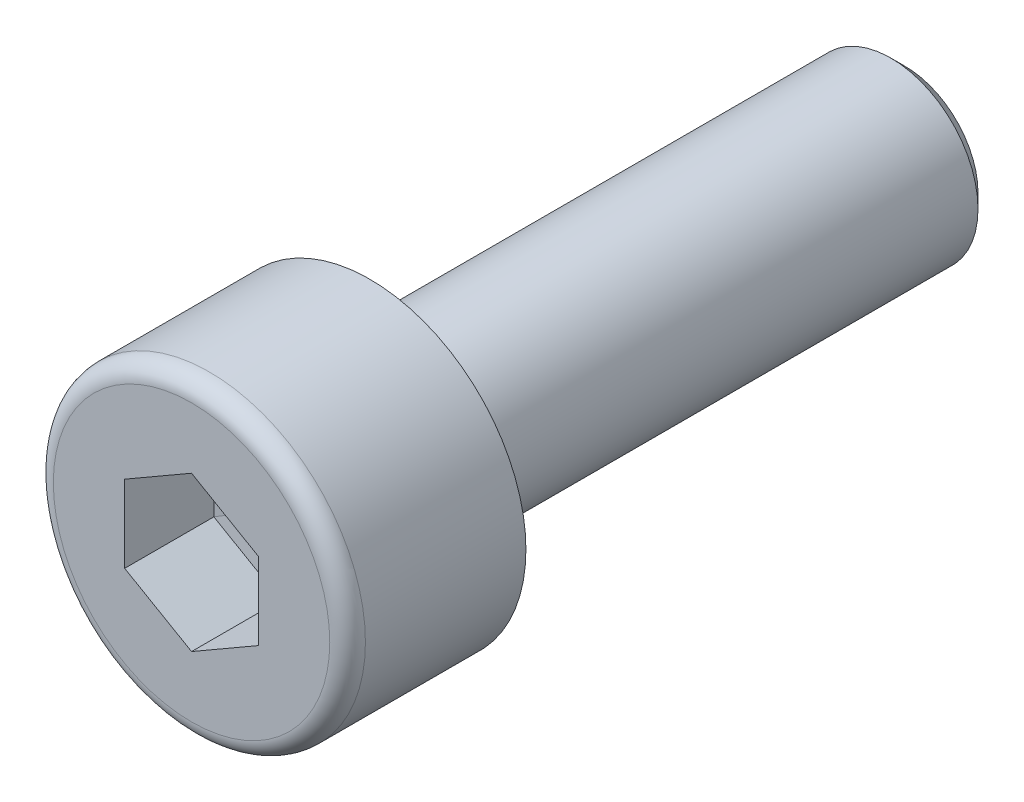
ISO-10303-21;
HEADER;
FILE_DESCRIPTION(('STEP AP214'),'2;1');
FILE_NAME('part.step','',(''),(''),'','','');
FILE_SCHEMA(('AUTOMOTIVE_DESIGN { 1 0 10303 214 1 1 1 1 }'));
ENDSEC;
DATA;
#1=APPLICATION_CONTEXT('core data for automotive mechanical design processes');
#2=APPLICATION_PROTOCOL_DEFINITION('international standard','automotive_design',2000,#1);
#3=PRODUCT_CONTEXT('',#1,'mechanical');
#4=PRODUCT('Part','Part','',(#3));
#5=PRODUCT_RELATED_PRODUCT_CATEGORY('part','',(#4));
#6=PRODUCT_DEFINITION_FORMATION('','',#4);
#7=PRODUCT_DEFINITION_CONTEXT('part definition',#1,'design');
#8=PRODUCT_DEFINITION('design','',#6,#7);
#9=PRODUCT_DEFINITION_SHAPE('','',#8);
#10=(LENGTH_UNIT() NAMED_UNIT(*) SI_UNIT(.MILLI.,.METRE.));
#11=(NAMED_UNIT(*) PLANE_ANGLE_UNIT() SI_UNIT($,.RADIAN.));
#12=(NAMED_UNIT(*) SI_UNIT($,.STERADIAN.) SOLID_ANGLE_UNIT());
#13=UNCERTAINTY_MEASURE_WITH_UNIT(LENGTH_MEASURE(1.E-05),#10,'distance_accuracy_value','');
#14=(GEOMETRIC_REPRESENTATION_CONTEXT(3) GLOBAL_UNCERTAINTY_ASSIGNED_CONTEXT((#13)) GLOBAL_UNIT_ASSIGNED_CONTEXT((#10,
#11,#12)) REPRESENTATION_CONTEXT('',''));
#15=CARTESIAN_POINT('',(0.,0.,0.));
#16=DIRECTION('',(0.,0.,1.));
#17=DIRECTION('',(1.,0.,0.));
#18=AXIS2_PLACEMENT_3D('',#15,#16,#17);
#19=CARTESIAN_POINT('',(-2.,0.,-5.5228302982804E-13));
#20=DIRECTION('',(0.,0.,-1.));
#21=DIRECTION('',(0.,-1.,0.));
#22=AXIS2_PLACEMENT_3D('',#19,#20,#21);
#23=PLANE('',#22);
#24=CARTESIAN_POINT('',(0.,0.,-5.47339951140202E-13));
#25=DIRECTION('',(0.,0.,-1.));
#26=DIRECTION('',(-1.,0.,0.));
#27=AXIS2_PLACEMENT_3D('',#24,#25,#26);
#28=CIRCLE('',#27,1.954);
#29=CARTESIAN_POINT('',(1.954,0.,-5.43249127216521E-13));
#30=VERTEX_POINT('',#29);
#31=EDGE_CURVE('E11',#30,#30,#28,.T.);
#32=ORIENTED_EDGE('',*,*,#31,.F.);
#33=EDGE_LOOP('',(#32));
#34=FACE_BOUND('',#33,.T.);
#35=CARTESIAN_POINT('',(0.,0.,-9.58579619196179E-13));
#36=DIRECTION('',(0.,0.,-1.));
#37=DIRECTION('',(1.,0.,0.));
#38=AXIS2_PLACEMENT_3D('',#35,#36,#37);
#39=CIRCLE('',#38,3.5);
#40=CARTESIAN_POINT('',(3.5,0.,-9.51738687859915E-13));
#41=VERTEX_POINT('',#40);
#42=EDGE_CURVE('E189',#41,#41,#39,.T.);
#43=ORIENTED_EDGE('',*,*,#42,.T.);
#44=EDGE_LOOP('',(#43));
#45=FACE_BOUND('',#44,.T.);
#46=ADVANCED_FACE('F17',(#34,#45),#23,.T.);
#47=CARTESIAN_POINT('',(0.,0.,-12.));
#48=DIRECTION('',(0.,0.,-1.));
#49=DIRECTION('',(0.,-1.,0.));
#50=AXIS2_PLACEMENT_3D('',#47,#48,#49);
#51=PLANE('',#50);
#52=CARTESIAN_POINT('',(0.,0.,-12.));
#53=DIRECTION('',(0.,0.,-1.));
#54=DIRECTION('',(-1.,0.,0.));
#55=AXIS2_PLACEMENT_3D('',#52,#53,#54);
#56=CIRCLE('',#55,1.64000000000213);
#57=CARTESIAN_POINT('',(1.64000000000213,0.,-12.));
#58=VERTEX_POINT('',#57);
#59=EDGE_CURVE('E123',#58,#58,#56,.T.);
#60=ORIENTED_EDGE('',*,*,#59,.T.);
#61=EDGE_LOOP('',(#60));
#62=FACE_BOUND('',#61,.T.);
#63=ADVANCED_FACE('F488',(#62),#51,.T.);
#64=CARTESIAN_POINT('',(0.,0.,-6.00000000000027));
#65=DIRECTION('',(0.,0.,-1.));
#66=DIRECTION('',(-1.,0.,0.));
#67=AXIS2_PLACEMENT_3D('',#64,#65,#66);
#68=CYLINDRICAL_SURFACE('',#67,1.954);
#69=CARTESIAN_POINT('',(0.,0.,-11.6860000000025));
#70=DIRECTION('',(0.,0.,1.));
#71=DIRECTION('',(-1.,0.,0.));
#72=AXIS2_PLACEMENT_3D('',#69,#70,#71);
#73=CIRCLE('',#72,1.954);
#74=CARTESIAN_POINT('',(1.954,0.,-11.6860000000024));
#75=VERTEX_POINT('',#74);
#76=EDGE_CURVE('E116',#75,#75,#73,.T.);
#77=ORIENTED_EDGE('',*,*,#76,.T.);
#78=DIRECTION('',(0.,0.,1.));
#79=VECTOR('',#78,1.);
#80=CARTESIAN_POINT('',(1.954,0.,-6.00000000000027));
#81=LINE('',#80,#79);
#82=EDGE_CURVE('E25',#75,#30,#81,.T.);
#83=ORIENTED_EDGE('',*,*,#82,.T.);
#84=ORIENTED_EDGE('',*,*,#31,.T.);
#85=ORIENTED_EDGE('',*,*,#82,.F.);
#86=EDGE_LOOP('',(#77,#83,#84,#85));
#87=FACE_BOUND('',#86,.T.);
#88=ADVANCED_FACE('F114',(#87),#68,.T.);
#89=CARTESIAN_POINT('',(-1.5,0.866025403784439,4.));
#90=DIRECTION('',(-0.5,0.866025403784439,0.));
#91=DIRECTION('',(0.,0.,1.));
#92=AXIS2_PLACEMENT_3D('',#89,#90,#91);
#93=PLANE('',#92);
#94=DIRECTION('',(0.866025403784439,0.5,0.));
#95=VECTOR('',#94,1.);
#96=CARTESIAN_POINT('',(-2.4375,0.324759526419163,3.99999999999962));
#97=LINE('',#96,#95);
#98=CARTESIAN_POINT('',(-1.5,0.866025403784439,4.));
#99=VERTEX_POINT('',#98);
#100=CARTESIAN_POINT('',(0.,1.73205080756888,4.));
#101=VERTEX_POINT('',#100);
#102=EDGE_CURVE('E157',#99,#101,#97,.T.);
#103=ORIENTED_EDGE('',*,*,#102,.F.);
#104=DIRECTION('',(0.,0.,-1.));
#105=VECTOR('',#104,1.);
#106=CARTESIAN_POINT('',(-1.5,0.866025403784439,4.));
#107=LINE('',#106,#105);
#108=CARTESIAN_POINT('',(-1.5,0.866025403784439,2.));
#109=VERTEX_POINT('',#108);
#110=EDGE_CURVE('E227',#99,#109,#107,.T.);
#111=ORIENTED_EDGE('',*,*,#110,.T.);
#112=DIRECTION('',(0.866025403784439,0.5,0.));
#113=VECTOR('',#112,1.);
#114=CARTESIAN_POINT('',(0.,1.73205080756888,2.));
#115=LINE('',#114,#113);
#116=CARTESIAN_POINT('',(0.,1.73205080756888,2.));
#117=VERTEX_POINT('',#116);
#118=EDGE_CURVE('E221',#109,#117,#115,.T.);
#119=ORIENTED_EDGE('',*,*,#118,.T.);
#120=DIRECTION('',(0.,0.,-1.));
#121=VECTOR('',#120,1.);
#122=CARTESIAN_POINT('',(0.,1.73205080756888,4.));
#123=LINE('',#122,#121);
#124=EDGE_CURVE('E44',#101,#117,#123,.T.);
#125=ORIENTED_EDGE('',*,*,#124,.F.);
#126=EDGE_LOOP('',(#103,#111,#119,#125));
#127=FACE_BOUND('',#126,.T.);
#128=ADVANCED_FACE('F377',(#127),#93,.F.);
#129=CARTESIAN_POINT('',(0.,1.73205080756888,4.));
#130=DIRECTION('',(0.5,0.866025403784438,0.));
#131=DIRECTION('',(0.,0.,-1.));
#132=AXIS2_PLACEMENT_3D('',#129,#130,#131);
#133=PLANE('',#132);
#134=DIRECTION('',(0.866025403784438,-0.5,0.));
#135=VECTOR('',#134,1.);
#136=CARTESIAN_POINT('',(-0.9375,2.27331668493415,3.99999999999962));
#137=LINE('',#136,#135);
#138=CARTESIAN_POINT('',(1.5,0.866025403784438,4.));
#139=VERTEX_POINT('',#138);
#140=EDGE_CURVE('E164',#101,#139,#137,.T.);
#141=ORIENTED_EDGE('',*,*,#140,.F.);
#142=ORIENTED_EDGE('',*,*,#124,.T.);
#143=DIRECTION('',(0.866025403784438,-0.5,0.));
#144=VECTOR('',#143,1.);
#145=CARTESIAN_POINT('',(1.5,0.866025403784438,2.));
#146=LINE('',#145,#144);
#147=CARTESIAN_POINT('',(1.5,0.866025403784438,2.));
#148=VERTEX_POINT('',#147);
#149=EDGE_CURVE('E215',#117,#148,#146,.T.);
#150=ORIENTED_EDGE('',*,*,#149,.T.);
#151=DIRECTION('',(0.,0.,-1.));
#152=VECTOR('',#151,1.);
#153=CARTESIAN_POINT('',(1.5,0.866025403784438,4.));
#154=LINE('',#153,#152);
#155=EDGE_CURVE('E196',#139,#148,#154,.T.);
#156=ORIENTED_EDGE('',*,*,#155,.F.);
#157=EDGE_LOOP('',(#141,#142,#150,#156));
#158=FACE_BOUND('',#157,.T.);
#159=ADVANCED_FACE('F243',(#158),#133,.F.);
#160=CARTESIAN_POINT('',(1.5,0.866025403784438,4.));
#161=DIRECTION('',(1.,0.,0.));
#162=DIRECTION('',(0.,-1.,0.));
#163=AXIS2_PLACEMENT_3D('',#160,#161,#162);
#164=PLANE('',#163);
#165=DIRECTION('',(0.,-1.,0.));
#166=VECTOR('',#165,1.);
#167=CARTESIAN_POINT('',(1.5,0.433012701892219,3.99999999999963));
#168=LINE('',#167,#166);
#169=CARTESIAN_POINT('',(1.5,-0.866025403784439,4.));
#170=VERTEX_POINT('',#169);
#171=EDGE_CURVE('E168',#139,#170,#168,.T.);
#172=ORIENTED_EDGE('',*,*,#171,.F.);
#173=ORIENTED_EDGE('',*,*,#155,.T.);
#174=DIRECTION('',(0.,-1.,0.));
#175=VECTOR('',#174,1.);
#176=CARTESIAN_POINT('',(1.5,-0.866025403784439,2.));
#177=LINE('',#176,#175);
#178=CARTESIAN_POINT('',(1.5,-0.866025403784439,2.));
#179=VERTEX_POINT('',#178);
#180=EDGE_CURVE('E152',#148,#179,#177,.T.);
#181=ORIENTED_EDGE('',*,*,#180,.T.);
#182=DIRECTION('',(0.,0.,-1.));
#183=VECTOR('',#182,1.);
#184=CARTESIAN_POINT('',(1.5,-0.866025403784439,4.));
#185=LINE('',#184,#183);
#186=EDGE_CURVE('E193',#170,#179,#185,.T.);
#187=ORIENTED_EDGE('',*,*,#186,.F.);
#188=EDGE_LOOP('',(#172,#173,#181,#187));
#189=FACE_BOUND('',#188,.T.);
#190=ADVANCED_FACE('F238',(#189),#164,.F.);
#191=CARTESIAN_POINT('',(1.5,-0.866025403784439,4.));
#192=DIRECTION('',(0.5,-0.866025403784439,0.));
#193=DIRECTION('',(0.,0.,-1.));
#194=AXIS2_PLACEMENT_3D('',#191,#192,#193);
#195=PLANE('',#194);
#196=DIRECTION('',(-0.866025403784439,-0.5,0.));
#197=VECTOR('',#196,1.);
#198=CARTESIAN_POINT('',(-0.187500000000004,-1.84030398304193,3.99999999999963));
#199=LINE('',#198,#197);
#200=CARTESIAN_POINT('',(0.,-1.73205080756888,4.));
#201=VERTEX_POINT('',#200);
#202=EDGE_CURVE('E181',#170,#201,#199,.T.);
#203=ORIENTED_EDGE('',*,*,#202,.F.);
#204=ORIENTED_EDGE('',*,*,#186,.T.);
#205=DIRECTION('',(-0.866025403784439,-0.5,0.));
#206=VECTOR('',#205,1.);
#207=CARTESIAN_POINT('',(0.,-1.73205080756888,2.));
#208=LINE('',#207,#206);
#209=CARTESIAN_POINT('',(0.,-1.73205080756888,2.));
#210=VERTEX_POINT('',#209);
#211=EDGE_CURVE('E153',#179,#210,#208,.T.);
#212=ORIENTED_EDGE('',*,*,#211,.T.);
#213=DIRECTION('',(0.,0.,-1.));
#214=VECTOR('',#213,1.);
#215=CARTESIAN_POINT('',(0.,-1.73205080756888,4.));
#216=LINE('',#215,#214);
#217=EDGE_CURVE('E197',#201,#210,#216,.T.);
#218=ORIENTED_EDGE('',*,*,#217,.F.);
#219=EDGE_LOOP('',(#203,#204,#212,#218));
#220=FACE_BOUND('',#219,.T.);
#221=ADVANCED_FACE('F417',(#220),#195,.F.);
#222=CARTESIAN_POINT('',(0.,-1.73205080756888,4.));
#223=DIRECTION('',(-0.5,-0.866025403784439,0.));
#224=DIRECTION('',(-0.866025403784439,0.5,0.));
#225=AXIS2_PLACEMENT_3D('',#222,#223,#224);
#226=PLANE('',#225);
#227=DIRECTION('',(-0.866025403784439,0.5,0.));
#228=VECTOR('',#227,1.);
#229=CARTESIAN_POINT('',(-1.6875,-0.757772228311381,3.99999999999962));
#230=LINE('',#229,#228);
#231=CARTESIAN_POINT('',(-1.5,-0.866025403784438,4.));
#232=VERTEX_POINT('',#231);
#233=EDGE_CURVE('E185',#201,#232,#230,.T.);
#234=ORIENTED_EDGE('',*,*,#233,.F.);
#235=ORIENTED_EDGE('',*,*,#217,.T.);
#236=DIRECTION('',(-0.866025403784439,0.5,0.));
#237=VECTOR('',#236,1.);
#238=CARTESIAN_POINT('',(-1.5,-0.866025403784438,2.));
#239=LINE('',#238,#237);
#240=CARTESIAN_POINT('',(-1.5,-0.866025403784438,2.));
#241=VERTEX_POINT('',#240);
#242=EDGE_CURVE('E138',#210,#241,#239,.T.);
#243=ORIENTED_EDGE('',*,*,#242,.T.);
#244=DIRECTION('',(0.,0.,-1.));
#245=VECTOR('',#244,1.);
#246=CARTESIAN_POINT('',(-1.5,-0.866025403784438,4.));
#247=LINE('',#246,#245);
#248=EDGE_CURVE('E224',#232,#241,#247,.T.);
#249=ORIENTED_EDGE('',*,*,#248,.F.);
#250=EDGE_LOOP('',(#234,#235,#243,#249));
#251=FACE_BOUND('',#250,.T.);
#252=ADVANCED_FACE('F462',(#251),#226,.F.);
#253=CARTESIAN_POINT('',(-1.5,-0.866025403784438,4.));
#254=DIRECTION('',(-1.,0.,0.));
#255=DIRECTION('',(0.,0.,1.));
#256=AXIS2_PLACEMENT_3D('',#253,#254,#255);
#257=PLANE('',#256);
#258=DIRECTION('',(0.,1.,0.));
#259=VECTOR('',#258,1.);
#260=CARTESIAN_POINT('',(-1.5,-0.433012701892219,3.99999999999962));
#261=LINE('',#260,#259);
#262=EDGE_CURVE('E145',#232,#99,#261,.T.);
#263=ORIENTED_EDGE('',*,*,#262,.F.);
#264=ORIENTED_EDGE('',*,*,#248,.T.);
#265=DIRECTION('',(0.,1.,0.));
#266=VECTOR('',#265,1.);
#267=CARTESIAN_POINT('',(-1.5,0.866025403784439,2.));
#268=LINE('',#267,#266);
#269=EDGE_CURVE('E176',#241,#109,#268,.T.);
#270=ORIENTED_EDGE('',*,*,#269,.T.);
#271=ORIENTED_EDGE('',*,*,#110,.F.);
#272=EDGE_LOOP('',(#263,#264,#270,#271));
#273=FACE_BOUND('',#272,.T.);
#274=ADVANCED_FACE('F456',(#273),#257,.F.);
#275=CARTESIAN_POINT('',(0.,1.73205080756888,2.));
#276=DIRECTION('',(-0.043577871373829,0.0754790873051733,-0.996194698091746));
#277=DIRECTION('',(-0.999044587684655,0.,0.043702537889669));
#278=AXIS2_PLACEMENT_3D('',#275,#276,#277);
#279=PLANE('',#278);
#280=DIRECTION('',(0.,-0.997141949694317,-0.0755508581011306));
#281=VECTOR('',#280,1.);
#282=CARTESIAN_POINT('',(0.,1.3015097128034,1.96737901843634));
#283=LINE('',#282,#281);
#284=CARTESIAN_POINT('',(0.,0.,1.86876700471111));
#285=VERTEX_POINT('',#284);
#286=EDGE_CURVE('E218',#117,#285,#283,.T.);
#287=ORIENTED_EDGE('',*,*,#286,.F.);
#288=ORIENTED_EDGE('',*,*,#118,.F.);
#289=DIRECTION('',(0.863550259614423,-0.498570974847158,-0.0755508581011305));
#290=VECTOR('',#289,1.);
#291=CARTESIAN_POINT('',(-1.12714047455993,0.650754856401699,1.96737901843634));
#292=LINE('',#291,#290);
#293=EDGE_CURVE('E172',#109,#285,#292,.T.);
#294=ORIENTED_EDGE('',*,*,#293,.T.);
#295=EDGE_LOOP('',(#287,#288,#294));
#296=FACE_BOUND('',#295,.T.);
#297=ADVANCED_FACE('F448',(#296),#279,.F.);
#298=CARTESIAN_POINT('',(1.5,0.866025403784438,2.));
#299=DIRECTION('',(0.0435778713738291,0.0754790873051733,-0.996194698091746));
#300=DIRECTION('',(-0.999044587684655,0.,-0.0437025378896691));
#301=AXIS2_PLACEMENT_3D('',#298,#299,#300);
#302=PLANE('',#301);
#303=DIRECTION('',(-0.863550259614423,-0.498570974847158,-0.0755508581011305));
#304=VECTOR('',#303,1.);
#305=CARTESIAN_POINT('',(1.12714047455993,0.650754856401699,1.96737901843634));
#306=LINE('',#305,#304);
#307=EDGE_CURVE('E211',#148,#285,#306,.T.);
#308=ORIENTED_EDGE('',*,*,#307,.F.);
#309=ORIENTED_EDGE('',*,*,#149,.F.);
#310=ORIENTED_EDGE('',*,*,#286,.T.);
#311=EDGE_LOOP('',(#308,#309,#310));
#312=FACE_BOUND('',#311,.T.);
#313=ADVANCED_FACE('F245',(#312),#302,.F.);
#314=CARTESIAN_POINT('',(1.5,-0.866025403784439,2.));
#315=DIRECTION('',(0.0871557427476581,0.,-0.996194698091746));
#316=DIRECTION('',(0.,-1.,0.));
#317=AXIS2_PLACEMENT_3D('',#314,#315,#316);
#318=PLANE('',#317);
#319=DIRECTION('',(-0.863550259614423,0.498570974847159,-0.0755508581011305));
#320=VECTOR('',#319,1.);
#321=CARTESIAN_POINT('',(1.12714047455993,-0.650754856401699,1.96737901843634));
#322=LINE('',#321,#320);
#323=EDGE_CURVE('E148',#179,#285,#322,.T.);
#324=ORIENTED_EDGE('',*,*,#323,.F.);
#325=ORIENTED_EDGE('',*,*,#180,.F.);
#326=ORIENTED_EDGE('',*,*,#307,.T.);
#327=EDGE_LOOP('',(#324,#325,#326));
#328=FACE_BOUND('',#327,.T.);
#329=ADVANCED_FACE('F248',(#328),#318,.F.);
#330=CARTESIAN_POINT('',(0.,-1.73205080756888,2.));
#331=DIRECTION('',(0.043577871373829,-0.0754790873051733,-0.996194698091746));
#332=DIRECTION('',(0.,-0.997141949694317,0.0755508581011305));
#333=AXIS2_PLACEMENT_3D('',#330,#331,#332);
#334=PLANE('',#333);
#335=DIRECTION('',(0.,0.997141949694317,-0.0755508581011306));
#336=VECTOR('',#335,1.);
#337=CARTESIAN_POINT('',(0.,-1.3015097128034,1.96737901843634));
#338=LINE('',#337,#336);
#339=EDGE_CURVE('E142',#210,#285,#338,.T.);
#340=ORIENTED_EDGE('',*,*,#339,.F.);
#341=ORIENTED_EDGE('',*,*,#211,.F.);
#342=ORIENTED_EDGE('',*,*,#323,.T.);
#343=EDGE_LOOP('',(#340,#341,#342));
#344=FACE_BOUND('',#343,.T.);
#345=ADVANCED_FACE('F392',(#344),#334,.F.);
#346=CARTESIAN_POINT('',(-1.5,-0.866025403784438,2.));
#347=DIRECTION('',(-0.0435778713738291,-0.0754790873051733,-0.996194698091746));
#348=DIRECTION('',(0.,-0.997141949694317,0.0755508581011305));
#349=AXIS2_PLACEMENT_3D('',#346,#347,#348);
#350=PLANE('',#349);
#351=DIRECTION('',(0.863550259614423,0.498570974847158,-0.0755508581011305));
#352=VECTOR('',#351,1.);
#353=CARTESIAN_POINT('',(-1.12714047455993,-0.650754856401699,1.96737901843634));
#354=LINE('',#353,#352);
#355=EDGE_CURVE('E136',#241,#285,#354,.T.);
#356=ORIENTED_EDGE('',*,*,#355,.F.);
#357=ORIENTED_EDGE('',*,*,#242,.F.);
#358=ORIENTED_EDGE('',*,*,#339,.T.);
#359=EDGE_LOOP('',(#356,#357,#358));
#360=FACE_BOUND('',#359,.T.);
#361=ADVANCED_FACE('F425',(#360),#350,.F.);
#362=CARTESIAN_POINT('',(-1.5,0.866025403784439,2.));
#363=DIRECTION('',(-0.0871557427476581,0.,-0.996194698091746));
#364=DIRECTION('',(-0.996194698091746,0.,0.0871557427476581));
#365=AXIS2_PLACEMENT_3D('',#362,#363,#364);
#366=PLANE('',#365);
#367=ORIENTED_EDGE('',*,*,#293,.F.);
#368=ORIENTED_EDGE('',*,*,#269,.F.);
#369=ORIENTED_EDGE('',*,*,#355,.T.);
#370=EDGE_LOOP('',(#367,#368,#369));
#371=FACE_BOUND('',#370,.T.);
#372=ADVANCED_FACE('F401',(#371),#366,.F.);
#373=CARTESIAN_POINT('',(0.,0.,1.99999999999933));
#374=DIRECTION('',(0.,0.,-1.));
#375=DIRECTION('',(-1.,0.,0.));
#376=AXIS2_PLACEMENT_3D('',#373,#374,#375);
#377=CYLINDRICAL_SURFACE('',#376,3.5);
#378=ORIENTED_EDGE('',*,*,#42,.F.);
#379=DIRECTION('',(0.,0.,1.));
#380=VECTOR('',#379,1.);
#381=CARTESIAN_POINT('',(3.5,0.,1.99999999999934));
#382=LINE('',#381,#380);
#383=CARTESIAN_POINT('',(3.49999999999996,0.,3.59999999999963));
#384=VERTEX_POINT('',#383);
#385=EDGE_CURVE('E177',#41,#384,#382,.T.);
#386=ORIENTED_EDGE('',*,*,#385,.T.);
#387=CARTESIAN_POINT('',(0.,0.,3.59999999999963));
#388=DIRECTION('',(0.,0.,1.));
#389=DIRECTION('',(1.,0.,0.));
#390=AXIS2_PLACEMENT_3D('',#387,#388,#389);
#391=CIRCLE('',#390,3.5);
#392=EDGE_CURVE('E131',#384,#384,#391,.T.);
#393=ORIENTED_EDGE('',*,*,#392,.F.);
#394=ORIENTED_EDGE('',*,*,#385,.F.);
#395=EDGE_LOOP('',(#378,#386,#393,#394));
#396=FACE_BOUND('',#395,.T.);
#397=ADVANCED_FACE('F364',(#396),#377,.T.);
#398=CARTESIAN_POINT('',(-3.5,0.,3.99999999999962));
#399=DIRECTION('',(0.,0.,1.));
#400=DIRECTION('',(1.,0.,0.));
#401=AXIS2_PLACEMENT_3D('',#398,#399,#400);
#402=PLANE('',#401);
#403=ORIENTED_EDGE('',*,*,#262,.T.);
#404=ORIENTED_EDGE('',*,*,#102,.T.);
#405=ORIENTED_EDGE('',*,*,#140,.T.);
#406=ORIENTED_EDGE('',*,*,#171,.T.);
#407=ORIENTED_EDGE('',*,*,#202,.T.);
#408=ORIENTED_EDGE('',*,*,#233,.T.);
#409=EDGE_LOOP('',(#403,#404,#405,#406,#407,#408));
#410=FACE_BOUND('',#409,.T.);
#411=CARTESIAN_POINT('',(0.,0.,3.99999999999963));
#412=DIRECTION('',(0.,0.,-1.));
#413=DIRECTION('',(1.,0.,0.));
#414=AXIS2_PLACEMENT_3D('',#411,#412,#413);
#415=CIRCLE('',#414,3.1);
#416=CARTESIAN_POINT('',(3.09999999999996,0.,3.99999999999963));
#417=VERTEX_POINT('',#416);
#418=EDGE_CURVE('E143',#417,#417,#415,.T.);
#419=ORIENTED_EDGE('',*,*,#418,.F.);
#420=EDGE_LOOP('',(#419));
#421=FACE_BOUND('',#420,.T.);
#422=ADVANCED_FACE('F359',(#410,#421),#402,.T.);
#423=CARTESIAN_POINT('',(0.,0.,3.59999999999963));
#424=DIRECTION('',(0.,0.,-1.));
#425=DIRECTION('',(-1.,0.,0.));
#426=AXIS2_PLACEMENT_3D('',#423,#424,#425);
#427=TOROIDAL_SURFACE('',#426,3.1,0.4);
#428=ORIENTED_EDGE('',*,*,#392,.T.);
#429=CARTESIAN_POINT('',(3.09999999999996,0.,3.59999999999963));
#430=DIRECTION('',(0.,-1.,0.));
#431=DIRECTION('',(1.,0.,0.));
#432=AXIS2_PLACEMENT_3D('',#429,#430,#431);
#433=CIRCLE('',#432,0.4);
#434=EDGE_CURVE('E146',#384,#417,#433,.T.);
#435=ORIENTED_EDGE('',*,*,#434,.T.);
#436=ORIENTED_EDGE('',*,*,#418,.T.);
#437=ORIENTED_EDGE('',*,*,#434,.F.);
#438=EDGE_LOOP('',(#428,#435,#436,#437));
#439=FACE_BOUND('',#438,.T.);
#440=ADVANCED_FACE('F354',(#439),#427,.T.);
#441=CARTESIAN_POINT('',(0.,0.,-11.8));
#442=DIRECTION('',(0.,0.,1.));
#443=DIRECTION('',(-1.,0.,0.));
#444=AXIS2_PLACEMENT_3D('',#441,#442,#443);
#445=CONICAL_SURFACE('',#444,1.84000000000233,0.785398163397962);
#446=ORIENTED_EDGE('',*,*,#76,.F.);
#447=DIRECTION('',(-0.707106781186911,0.,-0.707106781186184));
#448=VECTOR('',#447,1.);
#449=CARTESIAN_POINT('',(1.84000000000233,0.,-11.8));
#450=LINE('',#449,#448);
#451=EDGE_CURVE('E121',#75,#58,#450,.T.);
#452=ORIENTED_EDGE('',*,*,#451,.T.);
#453=ORIENTED_EDGE('',*,*,#59,.F.);
#454=ORIENTED_EDGE('',*,*,#451,.F.);
#455=EDGE_LOOP('',(#446,#452,#453,#454));
#456=FACE_BOUND('',#455,.T.);
#457=ADVANCED_FACE('F122',(#456),#445,.T.);
#458=CLOSED_SHELL('',(#46,#63,#88,#128,#159,#190,#221,#252,#274,#297,#313,#329,#345,#361,#372,
#397,#422,#440,#457));
#459=MANIFOLD_SOLID_BREP('B1',#458);
#460=ADVANCED_BREP_SHAPE_REPRESENTATION('',(#18,#459),#14);
#461=SHAPE_DEFINITION_REPRESENTATION(#9,#460);
ENDSEC;
END-ISO-10303-21;
